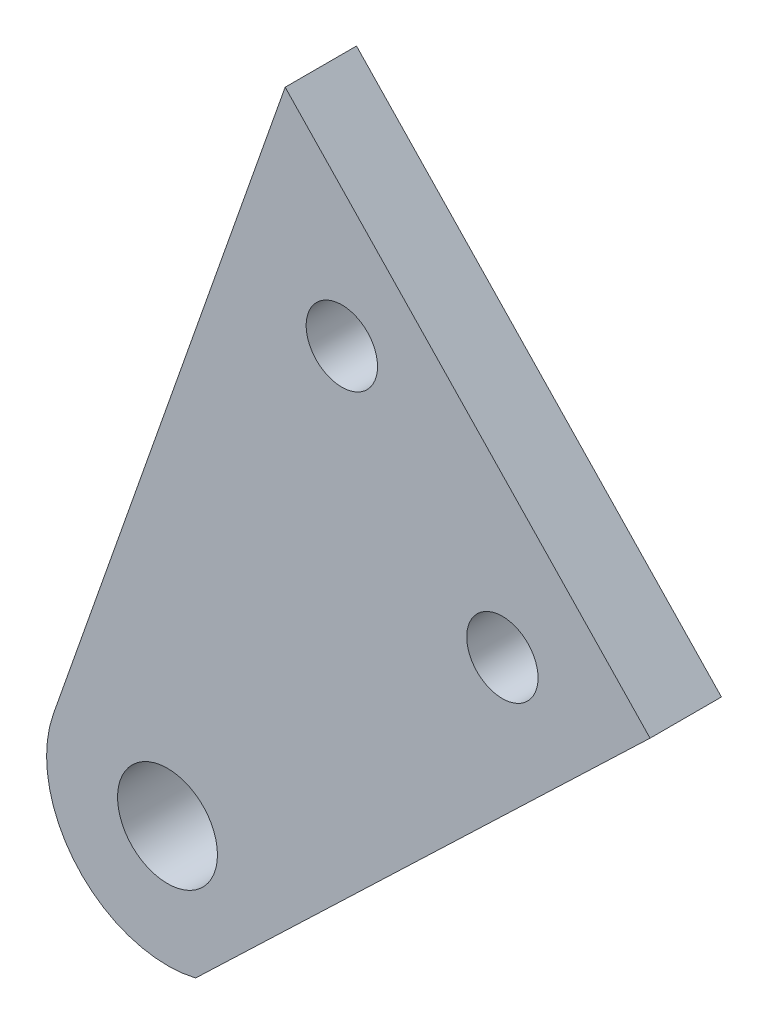
ISO-10303-21;
HEADER;
FILE_DESCRIPTION(('STEP AP214'),'2;1');
FILE_NAME('part.step','',(''),(''),'','','');
FILE_SCHEMA(('AUTOMOTIVE_DESIGN { 1 0 10303 214 1 1 1 1 }'));
ENDSEC;
DATA;
#1=APPLICATION_CONTEXT('core data for automotive mechanical design processes');
#2=APPLICATION_PROTOCOL_DEFINITION('international standard','automotive_design',2000,#1);
#3=PRODUCT_CONTEXT('',#1,'mechanical');
#4=PRODUCT('Part','Part','',(#3));
#5=PRODUCT_RELATED_PRODUCT_CATEGORY('part','',(#4));
#6=PRODUCT_DEFINITION_FORMATION('','',#4);
#7=PRODUCT_DEFINITION_CONTEXT('part definition',#1,'design');
#8=PRODUCT_DEFINITION('design','',#6,#7);
#9=PRODUCT_DEFINITION_SHAPE('','',#8);
#10=(LENGTH_UNIT() NAMED_UNIT(*) SI_UNIT(.MILLI.,.METRE.));
#11=(NAMED_UNIT(*) PLANE_ANGLE_UNIT() SI_UNIT($,.RADIAN.));
#12=(NAMED_UNIT(*) SI_UNIT($,.STERADIAN.) SOLID_ANGLE_UNIT());
#13=UNCERTAINTY_MEASURE_WITH_UNIT(LENGTH_MEASURE(1.E-05),#10,'distance_accuracy_value','');
#14=(GEOMETRIC_REPRESENTATION_CONTEXT(3) GLOBAL_UNCERTAINTY_ASSIGNED_CONTEXT((#13)) GLOBAL_UNIT_ASSIGNED_CONTEXT((#10,
#11,#12)) REPRESENTATION_CONTEXT('',''));
#15=CARTESIAN_POINT('',(0.,0.,0.));
#16=DIRECTION('',(0.,0.,1.));
#17=DIRECTION('',(1.,0.,0.));
#18=AXIS2_PLACEMENT_3D('',#15,#16,#17);
#19=CARTESIAN_POINT('',(-21.5106964248938,0.812658533401192,3.));
#20=DIRECTION('',(0.,0.,1.));
#21=DIRECTION('',(1.,0.,0.));
#22=AXIS2_PLACEMENT_3D('',#19,#20,#21);
#23=PLANE('',#22);
#24=DIRECTION('',(0.722478037361983,0.691393871486852,0.));
#25=VECTOR('',#24,1.);
#26=CARTESIAN_POINT('',(-6.09234455918187,8.92970688752314,3.));
#27=LINE('',#26,#25);
#28=CARTESIAN_POINT('',(-25.2038051769501,-9.35949508536238,3.));
#29=VERTEX_POINT('',#28);
#30=CARTESIAN_POINT('',(-6.09234455918187,8.92970688752314,3.));
#31=VERTEX_POINT('',#30);
#32=EDGE_CURVE('E89',#29,#31,#27,.T.);
#33=ORIENTED_EDGE('',*,*,#32,.T.);
#34=DIRECTION('',(-0.691393871486852,0.722478037361983,0.));
#35=VECTOR('',#34,1.);
#36=CARTESIAN_POINT('',(-21.4374180330416,24.9646748323907,3.));
#37=LINE('',#36,#35);
#38=CARTESIAN_POINT('',(-21.4374180330416,24.9646748323907,3.));
#39=VERTEX_POINT('',#38);
#40=EDGE_CURVE('E122',#31,#39,#37,.T.);
#41=ORIENTED_EDGE('',*,*,#40,.T.);
#42=DIRECTION('',(-0.331945347902781,-0.943298619741226,0.));
#43=VECTOR('',#42,1.);
#44=CARTESIAN_POINT('',(-21.4374180330416,24.9646748323907,3.));
#45=LINE('',#44,#43);
#46=CARTESIAN_POINT('',(-31.181574579852,-2.72557441864188,3.));
#47=VERTEX_POINT('',#46);
#48=EDGE_CURVE('E77',#39,#47,#45,.T.);
#49=ORIENTED_EDGE('',*,*,#48,.T.);
#50=CARTESIAN_POINT('',(-26.3848730304011,-4.41352638983748,3.));
#51=DIRECTION('',(0.,0.,1.));
#52=DIRECTION('',(1.,0.,0.));
#53=AXIS2_PLACEMENT_3D('',#50,#51,#52);
#54=CIRCLE('',#53,5.08502975522934);
#55=EDGE_CURVE('E108',#47,#29,#54,.T.);
#56=ORIENTED_EDGE('',*,*,#55,.T.);
#57=EDGE_LOOP('',(#33,#41,#49,#56));
#58=FACE_BOUND('',#57,.T.);
#59=CARTESIAN_POINT('',(-19.0539867422723,16.7309361937344,3.));
#60=DIRECTION('',(0.,0.,1.));
#61=DIRECTION('',(1.,0.,0.));
#62=AXIS2_PLACEMENT_3D('',#59,#60,#61);
#63=CIRCLE('',#62,1.50000000000002);
#64=CARTESIAN_POINT('',(-17.5539867422722,16.7309361937344,3.));
#65=VERTEX_POINT('',#64);
#66=EDGE_CURVE('E118',#65,#65,#63,.T.);
#67=ORIENTED_EDGE('',*,*,#66,.F.);
#68=EDGE_LOOP('',(#67));
#69=FACE_BOUND('',#68,.T.);
#70=CARTESIAN_POINT('',(-12.3032540456876,8.7654358003525,3.));
#71=DIRECTION('',(0.,0.,1.));
#72=DIRECTION('',(1.,0.,0.));
#73=AXIS2_PLACEMENT_3D('',#70,#71,#72);
#74=CIRCLE('',#73,1.5);
#75=CARTESIAN_POINT('',(-10.8032540456876,8.7654358003525,3.));
#76=VERTEX_POINT('',#75);
#77=EDGE_CURVE('E111',#76,#76,#74,.T.);
#78=ORIENTED_EDGE('',*,*,#77,.F.);
#79=EDGE_LOOP('',(#78));
#80=FACE_BOUND('',#79,.T.);
#81=CARTESIAN_POINT('',(-26.3848730304011,-4.41352638983748,3.));
#82=DIRECTION('',(0.,0.,1.));
#83=DIRECTION('',(1.,0.,0.));
#84=AXIS2_PLACEMENT_3D('',#81,#82,#83);
#85=CIRCLE('',#84,2.1);
#86=CARTESIAN_POINT('',(-24.2848730304011,-4.41352638983748,3.));
#87=VERTEX_POINT('',#86);
#88=EDGE_CURVE('E138',#87,#87,#85,.T.);
#89=ORIENTED_EDGE('',*,*,#88,.F.);
#90=EDGE_LOOP('',(#89));
#91=FACE_BOUND('',#90,.T.);
#92=ADVANCED_FACE('F41',(#58,#69,#80,#91),#23,.T.);
#93=CARTESIAN_POINT('',(-21.5106964248938,0.812658533401192,0.));
#94=DIRECTION('',(0.,0.,1.));
#95=DIRECTION('',(1.,0.,0.));
#96=AXIS2_PLACEMENT_3D('',#93,#94,#95);
#97=PLANE('',#96);
#98=DIRECTION('',(-0.691393871486852,0.722478037361983,0.));
#99=VECTOR('',#98,1.);
#100=CARTESIAN_POINT('',(-21.4374180330416,24.9646748323907,0.));
#101=LINE('',#100,#99);
#102=CARTESIAN_POINT('',(-6.09234455918187,8.92970688752314,0.));
#103=VERTEX_POINT('',#102);
#104=CARTESIAN_POINT('',(-21.4374180330416,24.9646748323907,0.));
#105=VERTEX_POINT('',#104);
#106=EDGE_CURVE('E99',#103,#105,#101,.T.);
#107=ORIENTED_EDGE('',*,*,#106,.F.);
#108=DIRECTION('',(0.722478037361983,0.691393871486852,0.));
#109=VECTOR('',#108,1.);
#110=CARTESIAN_POINT('',(-6.09234455918187,8.92970688752314,0.));
#111=LINE('',#110,#109);
#112=CARTESIAN_POINT('',(-25.2038051769501,-9.35949508536238,0.));
#113=VERTEX_POINT('',#112);
#114=EDGE_CURVE('E90',#113,#103,#111,.T.);
#115=ORIENTED_EDGE('',*,*,#114,.F.);
#116=CARTESIAN_POINT('',(-26.3848730304011,-4.41352638983748,0.));
#117=DIRECTION('',(0.,0.,1.));
#118=DIRECTION('',(1.,0.,0.));
#119=AXIS2_PLACEMENT_3D('',#116,#117,#118);
#120=CIRCLE('',#119,5.08502975522934);
#121=CARTESIAN_POINT('',(-31.181574579852,-2.72557441864188,0.));
#122=VERTEX_POINT('',#121);
#123=EDGE_CURVE('E98',#122,#113,#120,.T.);
#124=ORIENTED_EDGE('',*,*,#123,.F.);
#125=DIRECTION('',(-0.331945347902781,-0.943298619741226,0.));
#126=VECTOR('',#125,1.);
#127=CARTESIAN_POINT('',(-21.4374180330416,24.9646748323907,0.));
#128=LINE('',#127,#126);
#129=EDGE_CURVE('E103',#105,#122,#128,.T.);
#130=ORIENTED_EDGE('',*,*,#129,.F.);
#131=EDGE_LOOP('',(#107,#115,#124,#130));
#132=FACE_BOUND('',#131,.T.);
#133=CARTESIAN_POINT('',(-19.0539867422723,16.7309361937344,0.));
#134=DIRECTION('',(0.,0.,1.));
#135=DIRECTION('',(1.,0.,0.));
#136=AXIS2_PLACEMENT_3D('',#133,#134,#135);
#137=CIRCLE('',#136,1.50000000000002);
#138=CARTESIAN_POINT('',(-17.5539867422722,16.7309361937344,0.));
#139=VERTEX_POINT('',#138);
#140=EDGE_CURVE('E120',#139,#139,#137,.T.);
#141=ORIENTED_EDGE('',*,*,#140,.T.);
#142=EDGE_LOOP('',(#141));
#143=FACE_BOUND('',#142,.T.);
#144=CARTESIAN_POINT('',(-12.3032540456876,8.7654358003525,0.));
#145=DIRECTION('',(0.,0.,1.));
#146=DIRECTION('',(1.,0.,0.));
#147=AXIS2_PLACEMENT_3D('',#144,#145,#146);
#148=CIRCLE('',#147,1.5);
#149=CARTESIAN_POINT('',(-10.8032540456876,8.7654358003525,0.));
#150=VERTEX_POINT('',#149);
#151=EDGE_CURVE('E95',#150,#150,#148,.T.);
#152=ORIENTED_EDGE('',*,*,#151,.T.);
#153=EDGE_LOOP('',(#152));
#154=FACE_BOUND('',#153,.T.);
#155=CARTESIAN_POINT('',(-26.3848730304011,-4.41352638983748,0.));
#156=DIRECTION('',(0.,0.,1.));
#157=DIRECTION('',(1.,0.,0.));
#158=AXIS2_PLACEMENT_3D('',#155,#156,#157);
#159=CIRCLE('',#158,2.1);
#160=CARTESIAN_POINT('',(-24.2848730304011,-4.41352638983748,0.));
#161=VERTEX_POINT('',#160);
#162=EDGE_CURVE('E109',#161,#161,#159,.T.);
#163=ORIENTED_EDGE('',*,*,#162,.T.);
#164=EDGE_LOOP('',(#163));
#165=FACE_BOUND('',#164,.T.);
#166=ADVANCED_FACE('F96',(#132,#143,#154,#165),#97,.F.);
#167=CARTESIAN_POINT('',(-21.4374180330416,24.9646748323907,3.));
#168=DIRECTION('',(-0.722478037361983,-0.691393871486852,0.));
#169=DIRECTION('',(0.691393871486852,-0.722478037361983,0.));
#170=AXIS2_PLACEMENT_3D('',#167,#168,#169);
#171=PLANE('',#170);
#172=ORIENTED_EDGE('',*,*,#106,.T.);
#173=DIRECTION('',(0.,0.,-1.));
#174=VECTOR('',#173,1.);
#175=CARTESIAN_POINT('',(-21.4374180330416,24.9646748323907,3.));
#176=LINE('',#175,#174);
#177=EDGE_CURVE('E49',#39,#105,#176,.T.);
#178=ORIENTED_EDGE('',*,*,#177,.F.);
#179=ORIENTED_EDGE('',*,*,#40,.F.);
#180=DIRECTION('',(0.,0.,-1.));
#181=VECTOR('',#180,1.);
#182=CARTESIAN_POINT('',(-6.09234455918187,8.92970688752314,3.));
#183=LINE('',#182,#181);
#184=EDGE_CURVE('E11',#31,#103,#183,.T.);
#185=ORIENTED_EDGE('',*,*,#184,.T.);
#186=EDGE_LOOP('',(#172,#178,#179,#185));
#187=FACE_BOUND('',#186,.T.);
#188=ADVANCED_FACE('F43',(#187),#171,.F.);
#189=CARTESIAN_POINT('',(-19.0539867422723,16.7309361937344,3.));
#190=DIRECTION('',(0.,0.,-1.));
#191=DIRECTION('',(-1.,0.,0.));
#192=AXIS2_PLACEMENT_3D('',#189,#190,#191);
#193=CYLINDRICAL_SURFACE('',#192,1.50000000000002);
#194=ORIENTED_EDGE('',*,*,#66,.T.);
#195=EDGE_LOOP('',(#194));
#196=FACE_BOUND('',#195,.T.);
#197=ORIENTED_EDGE('',*,*,#140,.F.);
#198=EDGE_LOOP('',(#197));
#199=FACE_BOUND('',#198,.T.);
#200=ADVANCED_FACE('F165',(#196,#199),#193,.F.);
#201=CARTESIAN_POINT('',(-12.3032540456876,8.7654358003525,3.));
#202=DIRECTION('',(0.,0.,-1.));
#203=DIRECTION('',(-1.,0.,0.));
#204=AXIS2_PLACEMENT_3D('',#201,#202,#203);
#205=CYLINDRICAL_SURFACE('',#204,1.5);
#206=ORIENTED_EDGE('',*,*,#77,.T.);
#207=EDGE_LOOP('',(#206));
#208=FACE_BOUND('',#207,.T.);
#209=ORIENTED_EDGE('',*,*,#151,.F.);
#210=EDGE_LOOP('',(#209));
#211=FACE_BOUND('',#210,.T.);
#212=ADVANCED_FACE('F157',(#208,#211),#205,.F.);
#213=CARTESIAN_POINT('',(-21.4374180330416,24.9646748323907,0.));
#214=DIRECTION('',(-0.943298619741226,0.331945347902781,0.));
#215=DIRECTION('',(-0.331945347902781,-0.943298619741226,0.));
#216=AXIS2_PLACEMENT_3D('',#213,#214,#215);
#217=PLANE('',#216);
#218=ORIENTED_EDGE('',*,*,#48,.F.);
#219=ORIENTED_EDGE('',*,*,#177,.T.);
#220=ORIENTED_EDGE('',*,*,#129,.T.);
#221=DIRECTION('',(0.,0.,1.));
#222=VECTOR('',#221,1.);
#223=CARTESIAN_POINT('',(-31.181574579852,-2.72557441864188,0.));
#224=LINE('',#223,#222);
#225=EDGE_CURVE('E85',#122,#47,#224,.T.);
#226=ORIENTED_EDGE('',*,*,#225,.T.);
#227=EDGE_LOOP('',(#218,#219,#220,#226));
#228=FACE_BOUND('',#227,.T.);
#229=ADVANCED_FACE('F154',(#228),#217,.T.);
#230=CARTESIAN_POINT('',(-6.09234455918187,8.92970688752314,0.));
#231=DIRECTION('',(0.691393871486852,-0.722478037361983,0.));
#232=DIRECTION('',(0.722478037361983,0.691393871486852,0.));
#233=AXIS2_PLACEMENT_3D('',#230,#231,#232);
#234=PLANE('',#233);
#235=ORIENTED_EDGE('',*,*,#32,.F.);
#236=DIRECTION('',(0.,0.,1.));
#237=VECTOR('',#236,1.);
#238=CARTESIAN_POINT('',(-25.2038051769501,-9.35949508536238,0.));
#239=LINE('',#238,#237);
#240=EDGE_CURVE('E88',#113,#29,#239,.T.);
#241=ORIENTED_EDGE('',*,*,#240,.F.);
#242=ORIENTED_EDGE('',*,*,#114,.T.);
#243=ORIENTED_EDGE('',*,*,#184,.F.);
#244=EDGE_LOOP('',(#235,#241,#242,#243));
#245=FACE_BOUND('',#244,.T.);
#246=ADVANCED_FACE('F86',(#245),#234,.T.);
#247=CARTESIAN_POINT('',(-26.3848730304011,-4.41352638983748,0.));
#248=DIRECTION('',(0.,0.,1.));
#249=DIRECTION('',(1.,0.,0.));
#250=AXIS2_PLACEMENT_3D('',#247,#248,#249);
#251=CYLINDRICAL_SURFACE('',#250,5.08502975522934);
#252=ORIENTED_EDGE('',*,*,#55,.F.);
#253=ORIENTED_EDGE('',*,*,#225,.F.);
#254=ORIENTED_EDGE('',*,*,#123,.T.);
#255=ORIENTED_EDGE('',*,*,#240,.T.);
#256=EDGE_LOOP('',(#252,#253,#254,#255));
#257=FACE_BOUND('',#256,.T.);
#258=ADVANCED_FACE('F105',(#257),#251,.T.);
#259=CARTESIAN_POINT('',(-26.3848730304011,-4.41352638983748,0.));
#260=DIRECTION('',(0.,0.,1.));
#261=DIRECTION('',(1.,0.,0.));
#262=AXIS2_PLACEMENT_3D('',#259,#260,#261);
#263=CYLINDRICAL_SURFACE('',#262,2.1);
#264=ORIENTED_EDGE('',*,*,#162,.F.);
#265=EDGE_LOOP('',(#264));
#266=FACE_BOUND('',#265,.T.);
#267=ORIENTED_EDGE('',*,*,#88,.T.);
#268=EDGE_LOOP('',(#267));
#269=FACE_BOUND('',#268,.T.);
#270=ADVANCED_FACE('F148',(#266,#269),#263,.F.);
#271=CLOSED_SHELL('',(#92,#166,#188,#200,#212,#229,#246,#258,#270));
#272=MANIFOLD_SOLID_BREP('B2',#271);
#273=ADVANCED_BREP_SHAPE_REPRESENTATION('',(#18,#272),#14);
#274=SHAPE_DEFINITION_REPRESENTATION(#9,#273);
ENDSEC;
END-ISO-10303-21;
